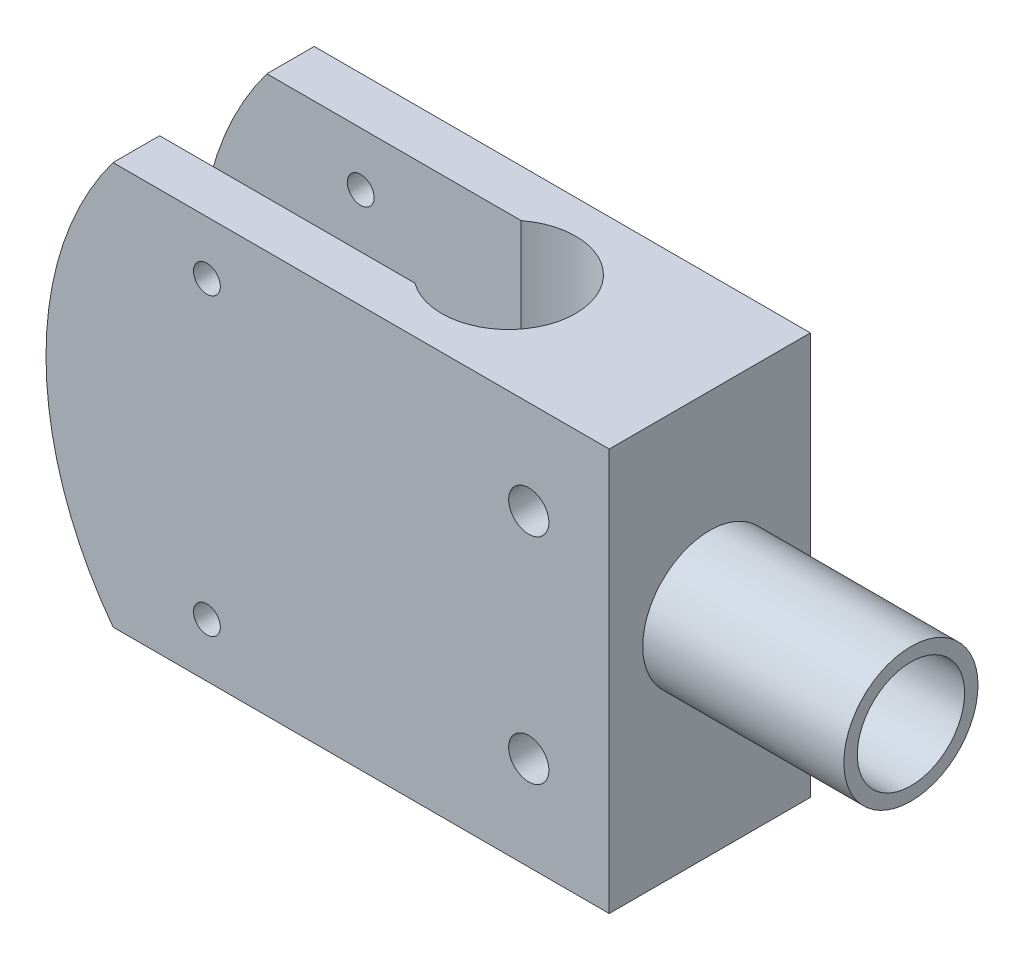
ISO-10303-21;
HEADER;
FILE_DESCRIPTION(('STEP AP214'),'2;1');
FILE_NAME('part.step','',(''),(''),'','','');
FILE_SCHEMA(('AUTOMOTIVE_DESIGN { 1 0 10303 214 1 1 1 1 }'));
ENDSEC;
DATA;
#1=APPLICATION_CONTEXT('core data for automotive mechanical design processes');
#2=APPLICATION_PROTOCOL_DEFINITION('international standard','automotive_design',2000,#1);
#3=PRODUCT_CONTEXT('',#1,'mechanical');
#4=PRODUCT('Part','Part','',(#3));
#5=PRODUCT_RELATED_PRODUCT_CATEGORY('part','',(#4));
#6=PRODUCT_DEFINITION_FORMATION('','',#4);
#7=PRODUCT_DEFINITION_CONTEXT('part definition',#1,'design');
#8=PRODUCT_DEFINITION('design','',#6,#7);
#9=PRODUCT_DEFINITION_SHAPE('','',#8);
#10=(LENGTH_UNIT() NAMED_UNIT(*) SI_UNIT(.MILLI.,.METRE.));
#11=(NAMED_UNIT(*) PLANE_ANGLE_UNIT() SI_UNIT($,.RADIAN.));
#12=(NAMED_UNIT(*) SI_UNIT($,.STERADIAN.) SOLID_ANGLE_UNIT());
#13=UNCERTAINTY_MEASURE_WITH_UNIT(LENGTH_MEASURE(1.E-05),#10,'distance_accuracy_value','');
#14=(GEOMETRIC_REPRESENTATION_CONTEXT(3) GLOBAL_UNCERTAINTY_ASSIGNED_CONTEXT((#13)) GLOBAL_UNIT_ASSIGNED_CONTEXT((#10,
#11,#12)) REPRESENTATION_CONTEXT('',''));
#15=CARTESIAN_POINT('',(0.,0.,0.));
#16=DIRECTION('',(0.,0.,1.));
#17=DIRECTION('',(1.,0.,0.));
#18=AXIS2_PLACEMENT_3D('',#15,#16,#17);
#19=CARTESIAN_POINT('',(0.,0.,15.));
#20=DIRECTION('',(0.,0.,-1.));
#21=DIRECTION('',(-1.,0.,0.));
#22=AXIS2_PLACEMENT_3D('',#19,#20,#21);
#23=PLANE('',#22);
#24=CARTESIAN_POINT('',(12.,26.,15.));
#25=DIRECTION('',(0.,0.,1.));
#26=DIRECTION('',(1.,0.,0.));
#27=AXIS2_PLACEMENT_3D('',#24,#25,#26);
#28=CIRCLE('',#27,1.);
#29=CARTESIAN_POINT('',(13.,26.,15.));
#30=VERTEX_POINT('',#29);
#31=EDGE_CURVE('E115',#30,#30,#28,.T.);
#32=ORIENTED_EDGE('',*,*,#31,.F.);
#33=EDGE_LOOP('',(#32));
#34=FACE_BOUND('',#33,.T.);
#35=CARTESIAN_POINT('',(12.,4.,15.));
#36=DIRECTION('',(0.,0.,1.));
#37=DIRECTION('',(1.,0.,0.));
#38=AXIS2_PLACEMENT_3D('',#35,#36,#37);
#39=CIRCLE('',#38,1.);
#40=CARTESIAN_POINT('',(13.,4.,15.));
#41=VERTEX_POINT('',#40);
#42=EDGE_CURVE('E122',#41,#41,#39,.T.);
#43=ORIENTED_EDGE('',*,*,#42,.F.);
#44=EDGE_LOOP('',(#43));
#45=FACE_BOUND('',#44,.T.);
#46=CARTESIAN_POINT('',(36.,23.,15.));
#47=DIRECTION('',(0.,0.,1.));
#48=DIRECTION('',(1.,0.,0.));
#49=AXIS2_PLACEMENT_3D('',#46,#47,#48);
#50=CIRCLE('',#49,1.5);
#51=CARTESIAN_POINT('',(37.5,23.,15.));
#52=VERTEX_POINT('',#51);
#53=EDGE_CURVE('E182',#52,#52,#50,.T.);
#54=ORIENTED_EDGE('',*,*,#53,.F.);
#55=EDGE_LOOP('',(#54));
#56=FACE_BOUND('',#55,.T.);
#57=CARTESIAN_POINT('',(36.,7.,15.));
#58=DIRECTION('',(0.,0.,1.));
#59=DIRECTION('',(1.,0.,0.));
#60=AXIS2_PLACEMENT_3D('',#57,#58,#59);
#61=CIRCLE('',#60,1.5);
#62=CARTESIAN_POINT('',(37.5,7.,15.));
#63=VERTEX_POINT('',#62);
#64=EDGE_CURVE('E178',#63,#63,#61,.T.);
#65=ORIENTED_EDGE('',*,*,#64,.F.);
#66=EDGE_LOOP('',(#65));
#67=FACE_BOUND('',#66,.T.);
#68=CARTESIAN_POINT('',(25.,15.,15.));
#69=DIRECTION('',(0.,0.,1.));
#70=DIRECTION('',(1.,0.,0.));
#71=AXIS2_PLACEMENT_3D('',#68,#69,#70);
#72=CIRCLE('',#71,25.);
#73=CARTESIAN_POINT('',(5.,0.,15.));
#74=VERTEX_POINT('',#73);
#75=CARTESIAN_POINT('',(5.,30.,15.));
#76=VERTEX_POINT('',#75);
#77=EDGE_CURVE('E137',#74,#76,#72,.F.);
#78=ORIENTED_EDGE('',*,*,#77,.F.);
#79=DIRECTION('',(1.,0.,0.));
#80=VECTOR('',#79,1.);
#81=CARTESIAN_POINT('',(0.,0.,15.));
#82=LINE('',#81,#80);
#83=CARTESIAN_POINT('',(42.,0.,15.));
#84=VERTEX_POINT('',#83);
#85=EDGE_CURVE('E101',#74,#84,#82,.T.);
#86=ORIENTED_EDGE('',*,*,#85,.T.);
#87=DIRECTION('',(0.,1.,0.));
#88=VECTOR('',#87,1.);
#89=CARTESIAN_POINT('',(42.,0.,15.));
#90=LINE('',#89,#88);
#91=CARTESIAN_POINT('',(42.,30.,15.));
#92=VERTEX_POINT('',#91);
#93=EDGE_CURVE('E64',#84,#92,#90,.T.);
#94=ORIENTED_EDGE('',*,*,#93,.T.);
#95=DIRECTION('',(-1.,0.,0.));
#96=VECTOR('',#95,1.);
#97=CARTESIAN_POINT('',(0.,30.,15.));
#98=LINE('',#97,#96);
#99=EDGE_CURVE('E95',#92,#76,#98,.T.);
#100=ORIENTED_EDGE('',*,*,#99,.T.);
#101=EDGE_LOOP('',(#78,#86,#94,#100));
#102=FACE_BOUND('',#101,.T.);
#103=ADVANCED_FACE('F38',(#34,#45,#56,#67,#102),#23,.F.);
#104=CARTESIAN_POINT('',(0.,0.,0.));
#105=DIRECTION('',(0.,0.,-1.));
#106=DIRECTION('',(-1.,0.,0.));
#107=AXIS2_PLACEMENT_3D('',#104,#105,#106);
#108=PLANE('',#107);
#109=CARTESIAN_POINT('',(12.,26.,0.));
#110=DIRECTION('',(0.,0.,-1.));
#111=DIRECTION('',(-1.,0.,0.));
#112=AXIS2_PLACEMENT_3D('',#109,#110,#111);
#113=CIRCLE('',#112,1.);
#114=CARTESIAN_POINT('',(11.,26.,0.));
#115=VERTEX_POINT('',#114);
#116=EDGE_CURVE('E134',#115,#115,#113,.T.);
#117=ORIENTED_EDGE('',*,*,#116,.F.);
#118=EDGE_LOOP('',(#117));
#119=FACE_BOUND('',#118,.T.);
#120=CARTESIAN_POINT('',(12.,4.,0.));
#121=DIRECTION('',(0.,0.,-1.));
#122=DIRECTION('',(-1.,0.,0.));
#123=AXIS2_PLACEMENT_3D('',#120,#121,#122);
#124=CIRCLE('',#123,1.);
#125=CARTESIAN_POINT('',(11.,4.,0.));
#126=VERTEX_POINT('',#125);
#127=EDGE_CURVE('E119',#126,#126,#124,.T.);
#128=ORIENTED_EDGE('',*,*,#127,.F.);
#129=EDGE_LOOP('',(#128));
#130=FACE_BOUND('',#129,.T.);
#131=CARTESIAN_POINT('',(36.,23.,0.));
#132=DIRECTION('',(0.,0.,1.));
#133=DIRECTION('',(1.,0.,0.));
#134=AXIS2_PLACEMENT_3D('',#131,#132,#133);
#135=CIRCLE('',#134,1.5);
#136=CARTESIAN_POINT('',(37.5,23.,0.));
#137=VERTEX_POINT('',#136);
#138=EDGE_CURVE('E179',#137,#137,#135,.T.);
#139=ORIENTED_EDGE('',*,*,#138,.T.);
#140=EDGE_LOOP('',(#139));
#141=FACE_BOUND('',#140,.T.);
#142=CARTESIAN_POINT('',(36.,7.,0.));
#143=DIRECTION('',(0.,0.,1.));
#144=DIRECTION('',(1.,0.,0.));
#145=AXIS2_PLACEMENT_3D('',#142,#143,#144);
#146=CIRCLE('',#145,1.5);
#147=CARTESIAN_POINT('',(37.5,7.,0.));
#148=VERTEX_POINT('',#147);
#149=EDGE_CURVE('E185',#148,#148,#146,.T.);
#150=ORIENTED_EDGE('',*,*,#149,.T.);
#151=EDGE_LOOP('',(#150));
#152=FACE_BOUND('',#151,.T.);
#153=DIRECTION('',(1.,0.,0.));
#154=VECTOR('',#153,1.);
#155=CARTESIAN_POINT('',(0.,0.,0.));
#156=LINE('',#155,#154);
#157=CARTESIAN_POINT('',(5.,0.,0.));
#158=VERTEX_POINT('',#157);
#159=CARTESIAN_POINT('',(42.,0.,0.));
#160=VERTEX_POINT('',#159);
#161=EDGE_CURVE('E88',#158,#160,#156,.T.);
#162=ORIENTED_EDGE('',*,*,#161,.F.);
#163=CARTESIAN_POINT('',(25.,15.,0.));
#164=DIRECTION('',(0.,0.,-1.));
#165=DIRECTION('',(-1.,0.,0.));
#166=AXIS2_PLACEMENT_3D('',#163,#164,#165);
#167=CIRCLE('',#166,25.);
#168=CARTESIAN_POINT('',(5.,30.,0.));
#169=VERTEX_POINT('',#168);
#170=EDGE_CURVE('E100',#169,#158,#167,.F.);
#171=ORIENTED_EDGE('',*,*,#170,.F.);
#172=DIRECTION('',(-1.,0.,0.));
#173=VECTOR('',#172,1.);
#174=CARTESIAN_POINT('',(0.,30.,0.));
#175=LINE('',#174,#173);
#176=CARTESIAN_POINT('',(42.,30.,0.));
#177=VERTEX_POINT('',#176);
#178=EDGE_CURVE('E87',#177,#169,#175,.T.);
#179=ORIENTED_EDGE('',*,*,#178,.F.);
#180=DIRECTION('',(0.,1.,0.));
#181=VECTOR('',#180,1.);
#182=CARTESIAN_POINT('',(42.,0.,0.));
#183=LINE('',#182,#181);
#184=EDGE_CURVE('E77',#160,#177,#183,.T.);
#185=ORIENTED_EDGE('',*,*,#184,.F.);
#186=EDGE_LOOP('',(#162,#171,#179,#185));
#187=FACE_BOUND('',#186,.T.);
#188=ADVANCED_FACE('F98',(#119,#130,#141,#152,#187),#108,.T.);
#189=CARTESIAN_POINT('',(0.,30.,3.53067148146466));
#190=DIRECTION('',(0.,0.,-1.));
#191=DIRECTION('',(-1.,0.,0.));
#192=AXIS2_PLACEMENT_3D('',#189,#190,#191);
#193=PLANE('',#192);
#194=CARTESIAN_POINT('',(12.,26.,3.53067148146466));
#195=DIRECTION('',(0.,0.,-1.));
#196=DIRECTION('',(-1.,0.,0.));
#197=AXIS2_PLACEMENT_3D('',#194,#195,#196);
#198=CIRCLE('',#197,1.);
#199=CARTESIAN_POINT('',(11.,26.,3.53067148146466));
#200=VERTEX_POINT('',#199);
#201=EDGE_CURVE('E131',#200,#200,#198,.T.);
#202=ORIENTED_EDGE('',*,*,#201,.T.);
#203=EDGE_LOOP('',(#202));
#204=FACE_BOUND('',#203,.T.);
#205=CARTESIAN_POINT('',(12.,4.,3.53067148146466));
#206=DIRECTION('',(0.,0.,-1.));
#207=DIRECTION('',(-1.,0.,0.));
#208=AXIS2_PLACEMENT_3D('',#205,#206,#207);
#209=CIRCLE('',#208,1.);
#210=CARTESIAN_POINT('',(11.,4.,3.53067148146466));
#211=VERTEX_POINT('',#210);
#212=EDGE_CURVE('E114',#211,#211,#209,.T.);
#213=ORIENTED_EDGE('',*,*,#212,.T.);
#214=EDGE_LOOP('',(#213));
#215=FACE_BOUND('',#214,.T.);
#216=CARTESIAN_POINT('',(25.,15.,3.53067148146466));
#217=DIRECTION('',(0.,0.,-1.));
#218=DIRECTION('',(-1.,0.,0.));
#219=AXIS2_PLACEMENT_3D('',#216,#217,#218);
#220=CIRCLE('',#219,25.);
#221=CARTESIAN_POINT('',(5.,30.,3.53067148146466));
#222=VERTEX_POINT('',#221);
#223=CARTESIAN_POINT('',(5.,0.,3.53067148146466));
#224=VERTEX_POINT('',#223);
#225=EDGE_CURVE('E141',#222,#224,#220,.F.);
#226=ORIENTED_EDGE('',*,*,#225,.T.);
#227=DIRECTION('',(1.,0.,0.));
#228=VECTOR('',#227,1.);
#229=CARTESIAN_POINT('',(0.,0.,3.53067148146466));
#230=LINE('',#229,#228);
#231=CARTESIAN_POINT('',(23.9595343922448,0.,3.53067148146466));
#232=VERTEX_POINT('',#231);
#233=EDGE_CURVE('E150',#224,#232,#230,.T.);
#234=ORIENTED_EDGE('',*,*,#233,.T.);
#235=DIRECTION('',(0.,-1.,0.));
#236=VECTOR('',#235,1.);
#237=CARTESIAN_POINT('',(23.9595343922448,30.,3.53067148146466));
#238=LINE('',#237,#236);
#239=CARTESIAN_POINT('',(23.9595343922448,30.,3.53067148146466));
#240=VERTEX_POINT('',#239);
#241=EDGE_CURVE('E164',#240,#232,#238,.T.);
#242=ORIENTED_EDGE('',*,*,#241,.F.);
#243=DIRECTION('',(1.,0.,0.));
#244=VECTOR('',#243,1.);
#245=CARTESIAN_POINT('',(0.,30.,3.53067148146466));
#246=LINE('',#245,#244);
#247=EDGE_CURVE('E153',#222,#240,#246,.T.);
#248=ORIENTED_EDGE('',*,*,#247,.F.);
#249=EDGE_LOOP('',(#226,#234,#242,#248));
#250=FACE_BOUND('',#249,.T.);
#251=ADVANCED_FACE('F221',(#204,#215,#250),#193,.F.);
#252=CARTESIAN_POINT('',(24.0413368883045,30.,11.5306714814647));
#253=DIRECTION('',(0.,0.,1.));
#254=DIRECTION('',(1.,0.,0.));
#255=AXIS2_PLACEMENT_3D('',#252,#253,#254);
#256=PLANE('',#255);
#257=CARTESIAN_POINT('',(12.,26.,11.5306714814647));
#258=DIRECTION('',(0.,0.,1.));
#259=DIRECTION('',(1.,0.,0.));
#260=AXIS2_PLACEMENT_3D('',#257,#258,#259);
#261=CIRCLE('',#260,1.);
#262=CARTESIAN_POINT('',(13.,26.,11.5306714814647));
#263=VERTEX_POINT('',#262);
#264=EDGE_CURVE('E42',#263,#263,#261,.T.);
#265=ORIENTED_EDGE('',*,*,#264,.T.);
#266=EDGE_LOOP('',(#265));
#267=FACE_BOUND('',#266,.T.);
#268=CARTESIAN_POINT('',(12.,4.,11.5306714814647));
#269=DIRECTION('',(0.,0.,1.));
#270=DIRECTION('',(1.,0.,0.));
#271=AXIS2_PLACEMENT_3D('',#268,#269,#270);
#272=CIRCLE('',#271,1.);
#273=CARTESIAN_POINT('',(13.,4.,11.5306714814647));
#274=VERTEX_POINT('',#273);
#275=EDGE_CURVE('E112',#274,#274,#272,.T.);
#276=ORIENTED_EDGE('',*,*,#275,.T.);
#277=EDGE_LOOP('',(#276));
#278=FACE_BOUND('',#277,.T.);
#279=DIRECTION('',(-1.,0.,0.));
#280=VECTOR('',#279,1.);
#281=CARTESIAN_POINT('',(24.0413368883045,0.,11.5306714814647));
#282=LINE('',#281,#280);
#283=CARTESIAN_POINT('',(24.0413368883045,0.,11.5306714814647));
#284=VERTEX_POINT('',#283);
#285=CARTESIAN_POINT('',(5.,0.,11.5306714814647));
#286=VERTEX_POINT('',#285);
#287=EDGE_CURVE('E159',#284,#286,#282,.T.);
#288=ORIENTED_EDGE('',*,*,#287,.T.);
#289=CARTESIAN_POINT('',(25.,15.,11.5306714814647));
#290=DIRECTION('',(0.,0.,1.));
#291=DIRECTION('',(1.,0.,0.));
#292=AXIS2_PLACEMENT_3D('',#289,#290,#291);
#293=CIRCLE('',#292,25.);
#294=CARTESIAN_POINT('',(5.,30.,11.5306714814647));
#295=VERTEX_POINT('',#294);
#296=EDGE_CURVE('E110',#286,#295,#293,.F.);
#297=ORIENTED_EDGE('',*,*,#296,.T.);
#298=DIRECTION('',(-1.,0.,0.));
#299=VECTOR('',#298,1.);
#300=CARTESIAN_POINT('',(24.0413368883045,30.,11.5306714814647));
#301=LINE('',#300,#299);
#302=CARTESIAN_POINT('',(24.0413368883045,30.,11.5306714814647));
#303=VERTEX_POINT('',#302);
#304=EDGE_CURVE('E149',#303,#295,#301,.T.);
#305=ORIENTED_EDGE('',*,*,#304,.F.);
#306=DIRECTION('',(0.,-1.,0.));
#307=VECTOR('',#306,1.);
#308=CARTESIAN_POINT('',(24.0413368883045,30.,11.5306714814647));
#309=LINE('',#308,#307);
#310=EDGE_CURVE('E156',#303,#284,#309,.T.);
#311=ORIENTED_EDGE('',*,*,#310,.T.);
#312=EDGE_LOOP('',(#288,#297,#305,#311));
#313=FACE_BOUND('',#312,.T.);
#314=ADVANCED_FACE('F230',(#267,#278,#313),#256,.F.);
#315=CARTESIAN_POINT('',(0.,0.,15.));
#316=DIRECTION('',(0.,1.,0.));
#317=DIRECTION('',(0.,0.,1.));
#318=AXIS2_PLACEMENT_3D('',#315,#316,#317);
#319=PLANE('',#318);
#320=ORIENTED_EDGE('',*,*,#85,.F.);
#321=DIRECTION('',(0.,0.,1.));
#322=VECTOR('',#321,1.);
#323=CARTESIAN_POINT('',(5.,0.,-15.));
#324=LINE('',#323,#322);
#325=EDGE_CURVE('E11',#74,#286,#324,.F.);
#326=ORIENTED_EDGE('',*,*,#325,.T.);
#327=ORIENTED_EDGE('',*,*,#287,.F.);
#328=CARTESIAN_POINT('',(27.,0.,7.5));
#329=DIRECTION('',(0.,-1.,0.));
#330=DIRECTION('',(0.,0.,-1.));
#331=AXIS2_PLACEMENT_3D('',#328,#329,#330);
#332=CIRCLE('',#331,5.);
#333=EDGE_CURVE('E145',#232,#284,#332,.T.);
#334=ORIENTED_EDGE('',*,*,#333,.F.);
#335=ORIENTED_EDGE('',*,*,#233,.F.);
#336=EDGE_CURVE('E47',#224,#158,#324,.F.);
#337=ORIENTED_EDGE('',*,*,#336,.T.);
#338=ORIENTED_EDGE('',*,*,#161,.T.);
#339=DIRECTION('',(0.,0.,-1.));
#340=VECTOR('',#339,1.);
#341=CARTESIAN_POINT('',(42.,0.,15.));
#342=LINE('',#341,#340);
#343=EDGE_CURVE('E83',#84,#160,#342,.T.);
#344=ORIENTED_EDGE('',*,*,#343,.F.);
#345=EDGE_LOOP('',(#320,#326,#327,#334,#335,#337,#338,#344));
#346=FACE_BOUND('',#345,.T.);
#347=ADVANCED_FACE('F40',(#346),#319,.F.);
#348=CARTESIAN_POINT('',(42.,0.,15.));
#349=DIRECTION('',(-1.,0.,0.));
#350=DIRECTION('',(0.,0.,1.));
#351=AXIS2_PLACEMENT_3D('',#348,#349,#350);
#352=PLANE('',#351);
#353=CARTESIAN_POINT('',(42.,16.,7.5));
#354=DIRECTION('',(-1.,0.,0.));
#355=DIRECTION('',(0.,0.,1.));
#356=AXIS2_PLACEMENT_3D('',#353,#354,#355);
#357=CIRCLE('',#356,5.);
#358=CARTESIAN_POINT('',(42.,16.,12.5));
#359=VERTEX_POINT('',#358);
#360=EDGE_CURVE('E107',#359,#359,#357,.F.);
#361=ORIENTED_EDGE('',*,*,#360,.F.);
#362=EDGE_LOOP('',(#361));
#363=FACE_BOUND('',#362,.T.);
#364=ORIENTED_EDGE('',*,*,#184,.T.);
#365=DIRECTION('',(0.,0.,-1.));
#366=VECTOR('',#365,1.);
#367=CARTESIAN_POINT('',(42.,30.,15.));
#368=LINE('',#367,#366);
#369=EDGE_CURVE('E80',#92,#177,#368,.T.);
#370=ORIENTED_EDGE('',*,*,#369,.F.);
#371=ORIENTED_EDGE('',*,*,#93,.F.);
#372=ORIENTED_EDGE('',*,*,#343,.T.);
#373=EDGE_LOOP('',(#364,#370,#371,#372));
#374=FACE_BOUND('',#373,.T.);
#375=ADVANCED_FACE('F79',(#363,#374),#352,.F.);
#376=CARTESIAN_POINT('',(0.,30.,15.));
#377=DIRECTION('',(0.,-1.,0.));
#378=DIRECTION('',(0.,0.,-1.));
#379=AXIS2_PLACEMENT_3D('',#376,#377,#378);
#380=PLANE('',#379);
#381=ORIENTED_EDGE('',*,*,#178,.T.);
#382=DIRECTION('',(0.,0.,1.));
#383=VECTOR('',#382,1.);
#384=CARTESIAN_POINT('',(5.,30.,-15.));
#385=LINE('',#384,#383);
#386=EDGE_CURVE('E140',#169,#222,#385,.T.);
#387=ORIENTED_EDGE('',*,*,#386,.T.);
#388=ORIENTED_EDGE('',*,*,#247,.T.);
#389=CARTESIAN_POINT('',(27.,30.,7.5));
#390=DIRECTION('',(0.,-1.,0.));
#391=DIRECTION('',(0.,0.,-1.));
#392=AXIS2_PLACEMENT_3D('',#389,#390,#391);
#393=CIRCLE('',#392,5.);
#394=EDGE_CURVE('E146',#240,#303,#393,.T.);
#395=ORIENTED_EDGE('',*,*,#394,.T.);
#396=ORIENTED_EDGE('',*,*,#304,.T.);
#397=EDGE_CURVE('E55',#295,#76,#385,.T.);
#398=ORIENTED_EDGE('',*,*,#397,.T.);
#399=ORIENTED_EDGE('',*,*,#99,.F.);
#400=ORIENTED_EDGE('',*,*,#369,.T.);
#401=EDGE_LOOP('',(#381,#387,#388,#395,#396,#398,#399,#400));
#402=FACE_BOUND('',#401,.T.);
#403=ADVANCED_FACE('F92',(#402),#380,.F.);
#404=CARTESIAN_POINT('',(36.,7.,0.));
#405=DIRECTION('',(0.,0.,1.));
#406=DIRECTION('',(1.,0.,0.));
#407=AXIS2_PLACEMENT_3D('',#404,#405,#406);
#408=CYLINDRICAL_SURFACE('',#407,1.5);
#409=ORIENTED_EDGE('',*,*,#149,.F.);
#410=EDGE_LOOP('',(#409));
#411=FACE_BOUND('',#410,.T.);
#412=ORIENTED_EDGE('',*,*,#64,.T.);
#413=EDGE_LOOP('',(#412));
#414=FACE_BOUND('',#413,.T.);
#415=ADVANCED_FACE('F256',(#411,#414),#408,.F.);
#416=CARTESIAN_POINT('',(36.,23.,0.));
#417=DIRECTION('',(0.,0.,1.));
#418=DIRECTION('',(1.,0.,0.));
#419=AXIS2_PLACEMENT_3D('',#416,#417,#418);
#420=CYLINDRICAL_SURFACE('',#419,1.5);
#421=ORIENTED_EDGE('',*,*,#138,.F.);
#422=EDGE_LOOP('',(#421));
#423=FACE_BOUND('',#422,.T.);
#424=ORIENTED_EDGE('',*,*,#53,.T.);
#425=EDGE_LOOP('',(#424));
#426=FACE_BOUND('',#425,.T.);
#427=ADVANCED_FACE('F289',(#423,#426),#420,.F.);
#428=CARTESIAN_POINT('',(57.,16.,7.5));
#429=DIRECTION('',(1.,0.,0.));
#430=DIRECTION('',(0.,0.,-1.));
#431=AXIS2_PLACEMENT_3D('',#428,#429,#430);
#432=PLANE('',#431);
#433=CARTESIAN_POINT('',(57.,16.,7.5));
#434=DIRECTION('',(1.,0.,0.));
#435=DIRECTION('',(0.,0.,-1.));
#436=AXIS2_PLACEMENT_3D('',#433,#434,#435);
#437=CIRCLE('',#436,5.);
#438=CARTESIAN_POINT('',(57.,16.,2.5));
#439=VERTEX_POINT('',#438);
#440=EDGE_CURVE('E173',#439,#439,#437,.T.);
#441=ORIENTED_EDGE('',*,*,#440,.T.);
#442=EDGE_LOOP('',(#441));
#443=FACE_BOUND('',#442,.T.);
#444=CARTESIAN_POINT('',(57.,16.,7.5));
#445=DIRECTION('',(1.,0.,0.));
#446=DIRECTION('',(0.,0.,-1.));
#447=AXIS2_PLACEMENT_3D('',#444,#445,#446);
#448=CIRCLE('',#447,4.);
#449=CARTESIAN_POINT('',(57.,16.,3.5));
#450=VERTEX_POINT('',#449);
#451=EDGE_CURVE('E170',#450,#450,#448,.T.);
#452=ORIENTED_EDGE('',*,*,#451,.F.);
#453=EDGE_LOOP('',(#452));
#454=FACE_BOUND('',#453,.T.);
#455=ADVANCED_FACE('F283',(#443,#454),#432,.T.);
#456=CARTESIAN_POINT('',(57.,16.,7.5));
#457=DIRECTION('',(-1.,0.,0.));
#458=DIRECTION('',(0.,0.,1.));
#459=AXIS2_PLACEMENT_3D('',#456,#457,#458);
#460=CYLINDRICAL_SURFACE('',#459,5.);
#461=ORIENTED_EDGE('',*,*,#440,.F.);
#462=EDGE_LOOP('',(#461));
#463=FACE_BOUND('',#462,.T.);
#464=ORIENTED_EDGE('',*,*,#360,.T.);
#465=EDGE_LOOP('',(#464));
#466=FACE_BOUND('',#465,.T.);
#467=ADVANCED_FACE('F275',(#463,#466),#460,.T.);
#468=CARTESIAN_POINT('',(57.,16.,7.5));
#469=DIRECTION('',(-1.,0.,0.));
#470=DIRECTION('',(0.,0.,1.));
#471=AXIS2_PLACEMENT_3D('',#468,#469,#470);
#472=CYLINDRICAL_SURFACE('',#471,4.);
#473=ORIENTED_EDGE('',*,*,#451,.T.);
#474=EDGE_LOOP('',(#473));
#475=FACE_BOUND('',#474,.T.);
#476=CARTESIAN_POINT('',(42.,16.,7.5));
#477=DIRECTION('',(1.,0.,0.));
#478=DIRECTION('',(0.,0.,-1.));
#479=AXIS2_PLACEMENT_3D('',#476,#477,#478);
#480=CIRCLE('',#479,4.);
#481=CARTESIAN_POINT('',(42.,16.,3.5));
#482=VERTEX_POINT('',#481);
#483=EDGE_CURVE('E167',#482,#482,#480,.T.);
#484=ORIENTED_EDGE('',*,*,#483,.F.);
#485=EDGE_LOOP('',(#484));
#486=FACE_BOUND('',#485,.T.);
#487=ADVANCED_FACE('F268',(#475,#486),#472,.F.);
#488=ORIENTED_EDGE('',*,*,#483,.T.);
#489=EDGE_LOOP('',(#488));
#490=FACE_BOUND('',#489,.T.);
#491=ADVANCED_FACE('F262',(#490),#352,.F.);
#492=CARTESIAN_POINT('',(27.,30.,7.5));
#493=DIRECTION('',(0.,-1.,0.));
#494=DIRECTION('',(0.,0.,-1.));
#495=AXIS2_PLACEMENT_3D('',#492,#493,#494);
#496=CYLINDRICAL_SURFACE('',#495,5.);
#497=ORIENTED_EDGE('',*,*,#333,.T.);
#498=ORIENTED_EDGE('',*,*,#310,.F.);
#499=ORIENTED_EDGE('',*,*,#394,.F.);
#500=ORIENTED_EDGE('',*,*,#241,.T.);
#501=EDGE_LOOP('',(#497,#498,#499,#500));
#502=FACE_BOUND('',#501,.T.);
#503=ADVANCED_FACE('F226',(#502),#496,.F.);
#504=CARTESIAN_POINT('',(25.,15.,-15.));
#505=DIRECTION('',(0.,0.,1.));
#506=DIRECTION('',(1.,0.,0.));
#507=AXIS2_PLACEMENT_3D('',#504,#505,#506);
#508=CYLINDRICAL_SURFACE('',#507,25.);
#509=ORIENTED_EDGE('',*,*,#296,.F.);
#510=ORIENTED_EDGE('',*,*,#325,.F.);
#511=ORIENTED_EDGE('',*,*,#77,.T.);
#512=ORIENTED_EDGE('',*,*,#397,.F.);
#513=EDGE_LOOP('',(#509,#510,#511,#512));
#514=FACE_BOUND('',#513,.T.);
#515=ADVANCED_FACE('F235',(#514),#508,.T.);
#516=ORIENTED_EDGE('',*,*,#170,.T.);
#517=ORIENTED_EDGE('',*,*,#336,.F.);
#518=ORIENTED_EDGE('',*,*,#225,.F.);
#519=ORIENTED_EDGE('',*,*,#386,.F.);
#520=EDGE_LOOP('',(#516,#517,#518,#519));
#521=FACE_BOUND('',#520,.T.);
#522=ADVANCED_FACE('F232',(#521),#508,.T.);
#523=CARTESIAN_POINT('',(12.,4.,-15.));
#524=DIRECTION('',(0.,0.,1.));
#525=DIRECTION('',(1.,0.,0.));
#526=AXIS2_PLACEMENT_3D('',#523,#524,#525);
#527=CYLINDRICAL_SURFACE('',#526,1.);
#528=ORIENTED_EDGE('',*,*,#42,.T.);
#529=EDGE_LOOP('',(#528));
#530=FACE_BOUND('',#529,.T.);
#531=ORIENTED_EDGE('',*,*,#275,.F.);
#532=EDGE_LOOP('',(#531));
#533=FACE_BOUND('',#532,.T.);
#534=ADVANCED_FACE('F234',(#530,#533),#527,.F.);
#535=CARTESIAN_POINT('',(12.,26.,-15.));
#536=DIRECTION('',(0.,0.,1.));
#537=DIRECTION('',(1.,0.,0.));
#538=AXIS2_PLACEMENT_3D('',#535,#536,#537);
#539=CYLINDRICAL_SURFACE('',#538,1.);
#540=ORIENTED_EDGE('',*,*,#31,.T.);
#541=EDGE_LOOP('',(#540));
#542=FACE_BOUND('',#541,.T.);
#543=ORIENTED_EDGE('',*,*,#264,.F.);
#544=EDGE_LOOP('',(#543));
#545=FACE_BOUND('',#544,.T.);
#546=ADVANCED_FACE('F241',(#542,#545),#539,.F.);
#547=ORIENTED_EDGE('',*,*,#127,.T.);
#548=EDGE_LOOP('',(#547));
#549=FACE_BOUND('',#548,.T.);
#550=ORIENTED_EDGE('',*,*,#212,.F.);
#551=EDGE_LOOP('',(#550));
#552=FACE_BOUND('',#551,.T.);
#553=ADVANCED_FACE('F244',(#549,#552),#527,.F.);
#554=ORIENTED_EDGE('',*,*,#116,.T.);
#555=EDGE_LOOP('',(#554));
#556=FACE_BOUND('',#555,.T.);
#557=ORIENTED_EDGE('',*,*,#201,.F.);
#558=EDGE_LOOP('',(#557));
#559=FACE_BOUND('',#558,.T.);
#560=ADVANCED_FACE('F373',(#556,#559),#539,.F.);
#561=CLOSED_SHELL('',(#103,#188,#251,#314,#347,#375,#403,#415,#427,#455,#467,#487,#491,#503,
#515,#522,#534,#546,#553,#560));
#562=MANIFOLD_SOLID_BREP('B2',#561);
#563=ADVANCED_BREP_SHAPE_REPRESENTATION('',(#18,#562),#14);
#564=SHAPE_DEFINITION_REPRESENTATION(#9,#563);
ENDSEC;
END-ISO-10303-21;
